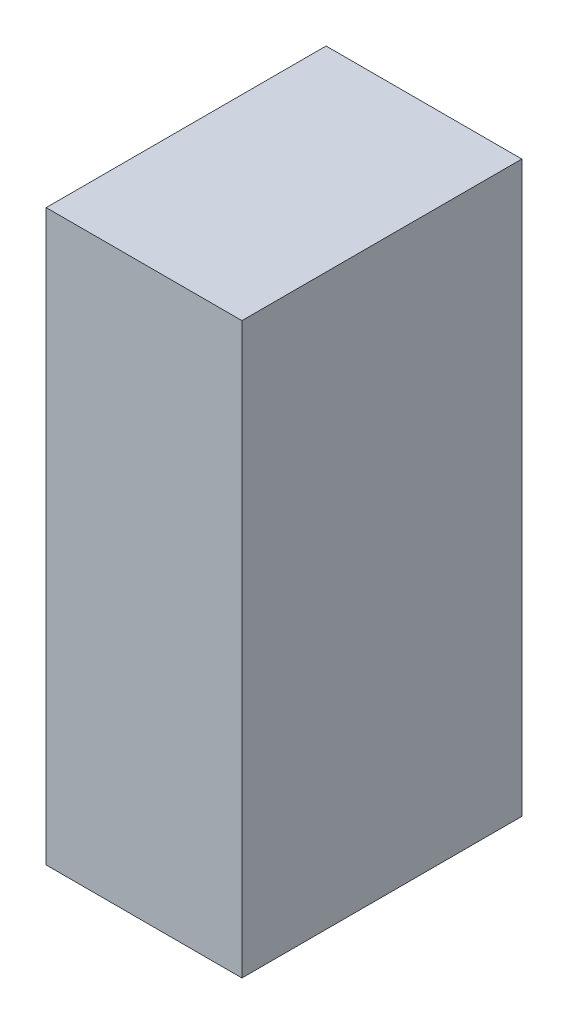
ISO-10303-21;
HEADER;
FILE_DESCRIPTION(('STEP AP214'),'2;1');
FILE_NAME('part.step','',(''),(''),'','','');
FILE_SCHEMA(('AUTOMOTIVE_DESIGN { 1 0 10303 214 1 1 1 1 }'));
ENDSEC;
DATA;
#1=APPLICATION_CONTEXT('core data for automotive mechanical design processes');
#2=APPLICATION_PROTOCOL_DEFINITION('international standard','automotive_design',2000,#1);
#3=PRODUCT_CONTEXT('',#1,'mechanical');
#4=PRODUCT('Part','Part','',(#3));
#5=PRODUCT_RELATED_PRODUCT_CATEGORY('part','',(#4));
#6=PRODUCT_DEFINITION_FORMATION('','',#4);
#7=PRODUCT_DEFINITION_CONTEXT('part definition',#1,'design');
#8=PRODUCT_DEFINITION('design','',#6,#7);
#9=PRODUCT_DEFINITION_SHAPE('','',#8);
#10=(LENGTH_UNIT() NAMED_UNIT(*) SI_UNIT(.MILLI.,.METRE.));
#11=(NAMED_UNIT(*) PLANE_ANGLE_UNIT() SI_UNIT($,.RADIAN.));
#12=(NAMED_UNIT(*) SI_UNIT($,.STERADIAN.) SOLID_ANGLE_UNIT());
#13=UNCERTAINTY_MEASURE_WITH_UNIT(LENGTH_MEASURE(1.E-05),#10,'distance_accuracy_value','');
#14=(GEOMETRIC_REPRESENTATION_CONTEXT(3) GLOBAL_UNCERTAINTY_ASSIGNED_CONTEXT((#13)) GLOBAL_UNIT_ASSIGNED_CONTEXT((#10,
#11,#12)) REPRESENTATION_CONTEXT('',''));
#15=CARTESIAN_POINT('',(0.,0.,0.));
#16=DIRECTION('',(0.,0.,1.));
#17=DIRECTION('',(1.,0.,0.));
#18=AXIS2_PLACEMENT_3D('',#15,#16,#17);
#19=CARTESIAN_POINT('',(-33.2390000000156,27.2313800000155,3.89916));
#20=DIRECTION('',(0.,0.,1.));
#21=DIRECTION('',(1.,-5.10347319959692E-12,0.));
#22=AXIS2_PLACEMENT_3D('',#19,#20,#21);
#23=PLANE('',#22);
#24=DIRECTION('',(1.,-5.10347319959692E-12,0.));
#25=VECTOR('',#24,1.);
#26=CARTESIAN_POINT('',(-33.2390000000156,27.2313800000155,3.89916));
#27=LINE('',#26,#25);
#28=CARTESIAN_POINT('',(-33.2390000000156,27.2313800000155,3.89916));
#29=VERTEX_POINT('',#28);
#30=CARTESIAN_POINT('',(-31.1430000000156,27.2313800000049,3.89916));
#31=VERTEX_POINT('',#30);
#32=EDGE_CURVE('E80',#29,#31,#27,.T.);
#33=ORIENTED_EDGE('',*,*,#32,.T.);
#34=DIRECTION('',(5.10347319959692E-12,1.,0.));
#35=VECTOR('',#34,1.);
#36=CARTESIAN_POINT('',(-31.1430000000156,27.2313800000049,3.89916));
#37=LINE('',#36,#35);
#38=CARTESIAN_POINT('',(-31.1429999999845,33.3273800000048,3.89916));
#39=VERTEX_POINT('',#38);
#40=EDGE_CURVE('E78',#31,#39,#37,.T.);
#41=ORIENTED_EDGE('',*,*,#40,.T.);
#42=DIRECTION('',(-1.,5.10347319959692E-12,0.));
#43=VECTOR('',#42,1.);
#44=CARTESIAN_POINT('',(-31.1429999999845,33.3273800000048,3.89916));
#45=LINE('',#44,#43);
#46=CARTESIAN_POINT('',(-33.2389999999845,33.3273800000155,3.89916));
#47=VERTEX_POINT('',#46);
#48=EDGE_CURVE('E20',#39,#47,#45,.T.);
#49=ORIENTED_EDGE('',*,*,#48,.T.);
#50=DIRECTION('',(-5.10347319959692E-12,-1.,0.));
#51=VECTOR('',#50,1.);
#52=CARTESIAN_POINT('',(-33.2389999999845,33.3273800000155,3.89916));
#53=LINE('',#52,#51);
#54=EDGE_CURVE('E11',#47,#29,#53,.T.);
#55=ORIENTED_EDGE('',*,*,#54,.T.);
#56=EDGE_LOOP('',(#33,#41,#49,#55));
#57=FACE_BOUND('',#56,.T.);
#58=ADVANCED_FACE('F16',(#57),#23,.T.);
#59=CARTESIAN_POINT('',(-33.2389999999845,33.3273800000155,0.90216));
#60=DIRECTION('',(0.,0.,-1.));
#61=DIRECTION('',(-5.10347319959692E-12,-1.,0.));
#62=AXIS2_PLACEMENT_3D('',#59,#60,#61);
#63=PLANE('',#62);
#64=DIRECTION('',(1.,-5.10347319959692E-12,0.));
#65=VECTOR('',#64,1.);
#66=CARTESIAN_POINT('',(-33.2389999999845,33.3273800000155,0.90216));
#67=LINE('',#66,#65);
#68=CARTESIAN_POINT('',(-33.2389999999845,33.3273800000155,0.90216));
#69=VERTEX_POINT('',#68);
#70=CARTESIAN_POINT('',(-31.1429999999845,33.3273800000048,0.90216));
#71=VERTEX_POINT('',#70);
#72=EDGE_CURVE('E62',#69,#71,#67,.T.);
#73=ORIENTED_EDGE('',*,*,#72,.T.);
#74=DIRECTION('',(-5.10347319959692E-12,-1.,0.));
#75=VECTOR('',#74,1.);
#76=CARTESIAN_POINT('',(-31.1429999999845,33.3273800000048,0.90216));
#77=LINE('',#76,#75);
#78=CARTESIAN_POINT('',(-31.1430000000156,27.2313800000049,0.90216));
#79=VERTEX_POINT('',#78);
#80=EDGE_CURVE('E87',#71,#79,#77,.T.);
#81=ORIENTED_EDGE('',*,*,#80,.T.);
#82=DIRECTION('',(-1.,5.10347319959692E-12,0.));
#83=VECTOR('',#82,1.);
#84=CARTESIAN_POINT('',(-31.1430000000156,27.2313800000049,0.90216));
#85=LINE('',#84,#83);
#86=CARTESIAN_POINT('',(-33.2390000000156,27.2313800000155,0.90216));
#87=VERTEX_POINT('',#86);
#88=EDGE_CURVE('E101',#79,#87,#85,.T.);
#89=ORIENTED_EDGE('',*,*,#88,.T.);
#90=DIRECTION('',(5.10347319959692E-12,1.,0.));
#91=VECTOR('',#90,1.);
#92=CARTESIAN_POINT('',(-33.2390000000156,27.2313800000155,0.90216));
#93=LINE('',#92,#91);
#94=EDGE_CURVE('E27',#87,#69,#93,.T.);
#95=ORIENTED_EDGE('',*,*,#94,.T.);
#96=EDGE_LOOP('',(#73,#81,#89,#95));
#97=FACE_BOUND('',#96,.T.);
#98=ADVANCED_FACE('F120',(#97),#63,.T.);
#99=CARTESIAN_POINT('',(-33.2389999999845,33.3273800000155,0.90216));
#100=DIRECTION('',(-1.,5.10347319959692E-12,0.));
#101=DIRECTION('',(0.,0.,1.));
#102=AXIS2_PLACEMENT_3D('',#99,#100,#101);
#103=PLANE('',#102);
#104=ORIENTED_EDGE('',*,*,#94,.F.);
#105=DIRECTION('',(0.,0.,1.));
#106=VECTOR('',#105,1.);
#107=CARTESIAN_POINT('',(-33.2390000000156,27.2313800000155,0.90216));
#108=LINE('',#107,#106);
#109=EDGE_CURVE('E93',#87,#29,#108,.T.);
#110=ORIENTED_EDGE('',*,*,#109,.T.);
#111=ORIENTED_EDGE('',*,*,#54,.F.);
#112=DIRECTION('',(0.,0.,-1.));
#113=VECTOR('',#112,1.);
#114=CARTESIAN_POINT('',(-33.2389999999845,33.3273800000155,3.89916));
#115=LINE('',#114,#113);
#116=EDGE_CURVE('E74',#47,#69,#115,.T.);
#117=ORIENTED_EDGE('',*,*,#116,.T.);
#118=EDGE_LOOP('',(#104,#110,#111,#117));
#119=FACE_BOUND('',#118,.T.);
#120=ADVANCED_FACE('F18',(#119),#103,.T.);
#121=CARTESIAN_POINT('',(-31.1429999999845,33.3273800000048,0.90216));
#122=DIRECTION('',(5.10347319959692E-12,1.,0.));
#123=DIRECTION('',(1.,-5.10347319959692E-12,0.));
#124=AXIS2_PLACEMENT_3D('',#121,#122,#123);
#125=PLANE('',#124);
#126=ORIENTED_EDGE('',*,*,#72,.F.);
#127=ORIENTED_EDGE('',*,*,#116,.F.);
#128=ORIENTED_EDGE('',*,*,#48,.F.);
#129=DIRECTION('',(0.,0.,-1.));
#130=VECTOR('',#129,1.);
#131=CARTESIAN_POINT('',(-31.1429999999845,33.3273800000048,3.89916));
#132=LINE('',#131,#130);
#133=EDGE_CURVE('E72',#39,#71,#132,.T.);
#134=ORIENTED_EDGE('',*,*,#133,.T.);
#135=EDGE_LOOP('',(#126,#127,#128,#134));
#136=FACE_BOUND('',#135,.T.);
#137=ADVANCED_FACE('F70',(#136),#125,.T.);
#138=CARTESIAN_POINT('',(-31.1430000000156,27.2313800000049,0.90216));
#139=DIRECTION('',(1.,-5.10347319959692E-12,0.));
#140=DIRECTION('',(5.10347319959692E-12,1.,0.));
#141=AXIS2_PLACEMENT_3D('',#138,#139,#140);
#142=PLANE('',#141);
#143=ORIENTED_EDGE('',*,*,#80,.F.);
#144=ORIENTED_EDGE('',*,*,#133,.F.);
#145=ORIENTED_EDGE('',*,*,#40,.F.);
#146=DIRECTION('',(0.,0.,-1.));
#147=VECTOR('',#146,1.);
#148=CARTESIAN_POINT('',(-31.1430000000156,27.2313800000049,3.89916));
#149=LINE('',#148,#147);
#150=EDGE_CURVE('E98',#31,#79,#149,.T.);
#151=ORIENTED_EDGE('',*,*,#150,.T.);
#152=EDGE_LOOP('',(#143,#144,#145,#151));
#153=FACE_BOUND('',#152,.T.);
#154=ADVANCED_FACE('F86',(#153),#142,.T.);
#155=CARTESIAN_POINT('',(-33.2390000000156,27.2313800000155,0.90216));
#156=DIRECTION('',(-5.10347319959692E-12,-1.,0.));
#157=DIRECTION('',(0.,0.,-1.));
#158=AXIS2_PLACEMENT_3D('',#155,#156,#157);
#159=PLANE('',#158);
#160=ORIENTED_EDGE('',*,*,#88,.F.);
#161=ORIENTED_EDGE('',*,*,#150,.F.);
#162=ORIENTED_EDGE('',*,*,#32,.F.);
#163=ORIENTED_EDGE('',*,*,#109,.F.);
#164=EDGE_LOOP('',(#160,#161,#162,#163));
#165=FACE_BOUND('',#164,.T.);
#166=ADVANCED_FACE('F123',(#165),#159,.T.);
#167=CLOSED_SHELL('',(#58,#98,#120,#137,#154,#166));
#168=MANIFOLD_SOLID_BREP('B1',#167);
#169=ADVANCED_BREP_SHAPE_REPRESENTATION('',(#18,#168),#14);
#170=SHAPE_DEFINITION_REPRESENTATION(#9,#169);
ENDSEC;
END-ISO-10303-21;
